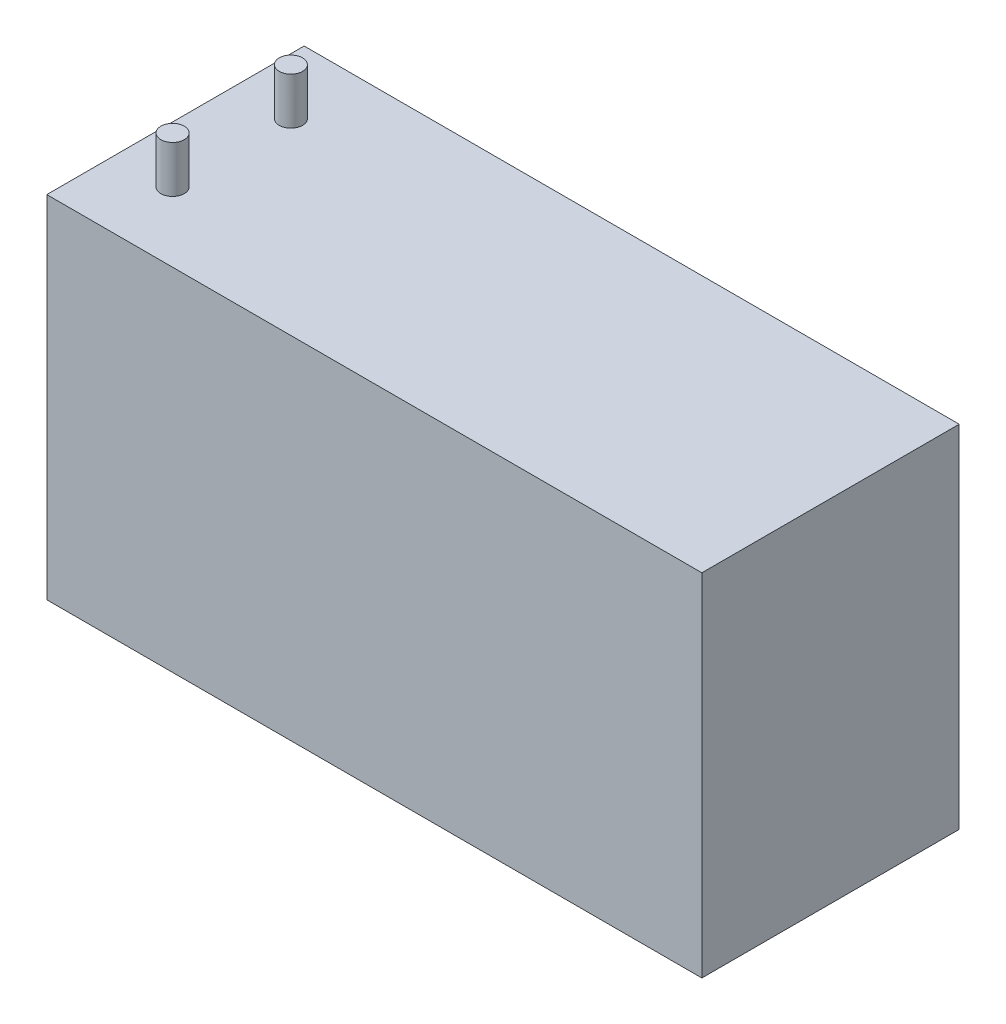
ISO-10303-21;
HEADER;
FILE_DESCRIPTION(('STEP AP214'),'2;1');
FILE_NAME('part.step','',(''),(''),'','','');
FILE_SCHEMA(('AUTOMOTIVE_DESIGN { 1 0 10303 214 1 1 1 1 }'));
ENDSEC;
DATA;
#1=APPLICATION_CONTEXT('core data for automotive mechanical design processes');
#2=APPLICATION_PROTOCOL_DEFINITION('international standard','automotive_design',2000,#1);
#3=PRODUCT_CONTEXT('',#1,'mechanical');
#4=PRODUCT('Part','Part','',(#3));
#5=PRODUCT_RELATED_PRODUCT_CATEGORY('part','',(#4));
#6=PRODUCT_DEFINITION_FORMATION('','',#4);
#7=PRODUCT_DEFINITION_CONTEXT('part definition',#1,'design');
#8=PRODUCT_DEFINITION('design','',#6,#7);
#9=PRODUCT_DEFINITION_SHAPE('','',#8);
#10=(LENGTH_UNIT() NAMED_UNIT(*) SI_UNIT(.MILLI.,.METRE.));
#11=(NAMED_UNIT(*) PLANE_ANGLE_UNIT() SI_UNIT($,.RADIAN.));
#12=(NAMED_UNIT(*) SI_UNIT($,.STERADIAN.) SOLID_ANGLE_UNIT());
#13=UNCERTAINTY_MEASURE_WITH_UNIT(LENGTH_MEASURE(1.E-05),#10,'distance_accuracy_value','');
#14=(GEOMETRIC_REPRESENTATION_CONTEXT(3) GLOBAL_UNCERTAINTY_ASSIGNED_CONTEXT((#13)) GLOBAL_UNIT_ASSIGNED_CONTEXT((#10,
#11,#12)) REPRESENTATION_CONTEXT('',''));
#15=CARTESIAN_POINT('',(0.,0.,0.));
#16=DIRECTION('',(0.,0.,1.));
#17=DIRECTION('',(1.,0.,0.));
#18=AXIS2_PLACEMENT_3D('',#15,#16,#17);
#19=CARTESIAN_POINT('',(14.,-7.5,11.));
#20=DIRECTION('',(-1.,0.,0.));
#21=DIRECTION('',(0.,0.,1.));
#22=AXIS2_PLACEMENT_3D('',#19,#20,#21);
#23=PLANE('',#22);
#24=DIRECTION('',(0.,1.,0.));
#25=VECTOR('',#24,1.);
#26=CARTESIAN_POINT('',(14.,-7.5,0.));
#27=LINE('',#26,#25);
#28=CARTESIAN_POINT('',(14.,-7.5,0.));
#29=VERTEX_POINT('',#28);
#30=CARTESIAN_POINT('',(14.,7.5,0.));
#31=VERTEX_POINT('',#30);
#32=EDGE_CURVE('E111',#29,#31,#27,.T.);
#33=ORIENTED_EDGE('',*,*,#32,.T.);
#34=DIRECTION('',(0.,0.,-1.));
#35=VECTOR('',#34,1.);
#36=CARTESIAN_POINT('',(14.,7.5,11.));
#37=LINE('',#36,#35);
#38=CARTESIAN_POINT('',(14.,7.5,11.));
#39=VERTEX_POINT('',#38);
#40=EDGE_CURVE('E100',#39,#31,#37,.T.);
#41=ORIENTED_EDGE('',*,*,#40,.F.);
#42=DIRECTION('',(0.,1.,0.));
#43=VECTOR('',#42,1.);
#44=CARTESIAN_POINT('',(14.,-7.5,11.));
#45=LINE('',#44,#43);
#46=CARTESIAN_POINT('',(14.,-7.5,11.));
#47=VERTEX_POINT('',#46);
#48=EDGE_CURVE('E92',#47,#39,#45,.T.);
#49=ORIENTED_EDGE('',*,*,#48,.F.);
#50=DIRECTION('',(0.,0.,-1.));
#51=VECTOR('',#50,1.);
#52=CARTESIAN_POINT('',(14.,-7.5,11.));
#53=LINE('',#52,#51);
#54=EDGE_CURVE('E107',#47,#29,#53,.T.);
#55=ORIENTED_EDGE('',*,*,#54,.T.);
#56=EDGE_LOOP('',(#33,#41,#49,#55));
#57=FACE_BOUND('',#56,.T.);
#58=ADVANCED_FACE('F39',(#57),#23,.F.);
#59=CARTESIAN_POINT('',(-14.,7.5,11.));
#60=DIRECTION('',(0.,-1.,0.));
#61=DIRECTION('',(0.,0.,-1.));
#62=AXIS2_PLACEMENT_3D('',#59,#60,#61);
#63=PLANE('',#62);
#64=CARTESIAN_POINT('',(-11.5946401527598,7.5,8.02818711278711));
#65=DIRECTION('',(0.,-1.,0.));
#66=DIRECTION('',(0.,0.,-1.));
#67=AXIS2_PLACEMENT_3D('',#64,#65,#66);
#68=CIRCLE('',#67,0.5);
#69=CARTESIAN_POINT('',(-11.5946401527598,7.5,7.52818711278711));
#70=VERTEX_POINT('',#69);
#71=EDGE_CURVE('E11',#70,#70,#68,.F.);
#72=ORIENTED_EDGE('',*,*,#71,.F.);
#73=EDGE_LOOP('',(#72));
#74=FACE_BOUND('',#73,.T.);
#75=CARTESIAN_POINT('',(-11.5946401527598,7.5,2.97181288721289));
#76=DIRECTION('',(0.,-1.,0.));
#77=DIRECTION('',(0.,0.,-1.));
#78=AXIS2_PLACEMENT_3D('',#75,#76,#77);
#79=CIRCLE('',#78,0.500000000000001);
#80=CARTESIAN_POINT('',(-11.5946401527598,7.5,2.47181288721289));
#81=VERTEX_POINT('',#80);
#82=EDGE_CURVE('E48',#81,#81,#79,.F.);
#83=ORIENTED_EDGE('',*,*,#82,.F.);
#84=EDGE_LOOP('',(#83));
#85=FACE_BOUND('',#84,.T.);
#86=DIRECTION('',(-1.,0.,0.));
#87=VECTOR('',#86,1.);
#88=CARTESIAN_POINT('',(-14.,7.5,0.));
#89=LINE('',#88,#87);
#90=CARTESIAN_POINT('',(-14.,7.5,0.));
#91=VERTEX_POINT('',#90);
#92=EDGE_CURVE('E98',#31,#91,#89,.T.);
#93=ORIENTED_EDGE('',*,*,#92,.T.);
#94=DIRECTION('',(0.,0.,-1.));
#95=VECTOR('',#94,1.);
#96=CARTESIAN_POINT('',(-14.,7.5,11.));
#97=LINE('',#96,#95);
#98=CARTESIAN_POINT('',(-14.,7.5,11.));
#99=VERTEX_POINT('',#98);
#100=EDGE_CURVE('E96',#99,#91,#97,.T.);
#101=ORIENTED_EDGE('',*,*,#100,.F.);
#102=DIRECTION('',(-1.,0.,0.));
#103=VECTOR('',#102,1.);
#104=CARTESIAN_POINT('',(-14.,7.5,11.));
#105=LINE('',#104,#103);
#106=EDGE_CURVE('E87',#39,#99,#105,.T.);
#107=ORIENTED_EDGE('',*,*,#106,.F.);
#108=ORIENTED_EDGE('',*,*,#40,.T.);
#109=EDGE_LOOP('',(#93,#101,#107,#108));
#110=FACE_BOUND('',#109,.T.);
#111=ADVANCED_FACE('F97',(#74,#85,#110),#63,.F.);
#112=CARTESIAN_POINT('',(-14.,-7.5,11.));
#113=DIRECTION('',(1.,0.,0.));
#114=DIRECTION('',(0.,0.,-1.));
#115=AXIS2_PLACEMENT_3D('',#112,#113,#114);
#116=PLANE('',#115);
#117=DIRECTION('',(0.,-1.,0.));
#118=VECTOR('',#117,1.);
#119=CARTESIAN_POINT('',(-14.,-7.5,0.));
#120=LINE('',#119,#118);
#121=CARTESIAN_POINT('',(-14.,-7.5,0.));
#122=VERTEX_POINT('',#121);
#123=EDGE_CURVE('E73',#91,#122,#120,.T.);
#124=ORIENTED_EDGE('',*,*,#123,.T.);
#125=DIRECTION('',(0.,0.,-1.));
#126=VECTOR('',#125,1.);
#127=CARTESIAN_POINT('',(-14.,-7.5,11.));
#128=LINE('',#127,#126);
#129=CARTESIAN_POINT('',(-14.,-7.5,11.));
#130=VERTEX_POINT('',#129);
#131=EDGE_CURVE('E101',#130,#122,#128,.T.);
#132=ORIENTED_EDGE('',*,*,#131,.F.);
#133=DIRECTION('',(0.,-1.,0.));
#134=VECTOR('',#133,1.);
#135=CARTESIAN_POINT('',(-14.,-7.5,11.));
#136=LINE('',#135,#134);
#137=EDGE_CURVE('E90',#99,#130,#136,.T.);
#138=ORIENTED_EDGE('',*,*,#137,.F.);
#139=ORIENTED_EDGE('',*,*,#100,.T.);
#140=EDGE_LOOP('',(#124,#132,#138,#139));
#141=FACE_BOUND('',#140,.T.);
#142=ADVANCED_FACE('F103',(#141),#116,.F.);
#143=CARTESIAN_POINT('',(-14.,-7.5,11.));
#144=DIRECTION('',(0.,1.,0.));
#145=DIRECTION('',(0.,0.,1.));
#146=AXIS2_PLACEMENT_3D('',#143,#144,#145);
#147=PLANE('',#146);
#148=DIRECTION('',(1.,0.,0.));
#149=VECTOR('',#148,1.);
#150=CARTESIAN_POINT('',(-14.,-7.5,0.));
#151=LINE('',#150,#149);
#152=EDGE_CURVE('E79',#122,#29,#151,.T.);
#153=ORIENTED_EDGE('',*,*,#152,.T.);
#154=ORIENTED_EDGE('',*,*,#54,.F.);
#155=DIRECTION('',(1.,0.,0.));
#156=VECTOR('',#155,1.);
#157=CARTESIAN_POINT('',(-14.,-7.5,11.));
#158=LINE('',#157,#156);
#159=EDGE_CURVE('E56',#130,#47,#158,.T.);
#160=ORIENTED_EDGE('',*,*,#159,.F.);
#161=ORIENTED_EDGE('',*,*,#131,.T.);
#162=EDGE_LOOP('',(#153,#154,#160,#161));
#163=FACE_BOUND('',#162,.T.);
#164=ADVANCED_FACE('F139',(#163),#147,.F.);
#165=CARTESIAN_POINT('',(0.,0.,11.));
#166=DIRECTION('',(0.,0.,-1.));
#167=DIRECTION('',(-1.,0.,0.));
#168=AXIS2_PLACEMENT_3D('',#165,#166,#167);
#169=PLANE('',#168);
#170=ORIENTED_EDGE('',*,*,#48,.T.);
#171=ORIENTED_EDGE('',*,*,#106,.T.);
#172=ORIENTED_EDGE('',*,*,#137,.T.);
#173=ORIENTED_EDGE('',*,*,#159,.T.);
#174=EDGE_LOOP('',(#170,#171,#172,#173));
#175=FACE_BOUND('',#174,.T.);
#176=ADVANCED_FACE('F88',(#175),#169,.F.);
#177=CARTESIAN_POINT('',(0.,0.,0.));
#178=DIRECTION('',(0.,0.,-1.));
#179=DIRECTION('',(-1.,0.,0.));
#180=AXIS2_PLACEMENT_3D('',#177,#178,#179);
#181=PLANE('',#180);
#182=ORIENTED_EDGE('',*,*,#32,.F.);
#183=ORIENTED_EDGE('',*,*,#152,.F.);
#184=ORIENTED_EDGE('',*,*,#123,.F.);
#185=ORIENTED_EDGE('',*,*,#92,.F.);
#186=EDGE_LOOP('',(#182,#183,#184,#185));
#187=FACE_BOUND('',#186,.T.);
#188=ADVANCED_FACE('F146',(#187),#181,.T.);
#189=CARTESIAN_POINT('',(-11.5946401527598,9.5,2.97181288721289));
#190=DIRECTION('',(0.,-1.,0.));
#191=DIRECTION('',(0.,0.,-1.));
#192=AXIS2_PLACEMENT_3D('',#189,#190,#191);
#193=CYLINDRICAL_SURFACE('',#192,0.500000000000001);
#194=CARTESIAN_POINT('',(-11.5946401527598,9.5,2.97181288721289));
#195=DIRECTION('',(0.,1.,0.));
#196=DIRECTION('',(0.,0.,1.));
#197=AXIS2_PLACEMENT_3D('',#194,#195,#196);
#198=CIRCLE('',#197,0.500000000000001);
#199=CARTESIAN_POINT('',(-11.5946401527598,9.5,3.47181288721289));
#200=VERTEX_POINT('',#199);
#201=EDGE_CURVE('E115',#200,#200,#198,.T.);
#202=ORIENTED_EDGE('',*,*,#201,.F.);
#203=EDGE_LOOP('',(#202));
#204=FACE_BOUND('',#203,.T.);
#205=ORIENTED_EDGE('',*,*,#82,.T.);
#206=EDGE_LOOP('',(#205));
#207=FACE_BOUND('',#206,.T.);
#208=ADVANCED_FACE('F131',(#204,#207),#193,.T.);
#209=CARTESIAN_POINT('',(-11.5946401527598,9.5,2.97181288721289));
#210=DIRECTION('',(0.,1.,0.));
#211=DIRECTION('',(0.,0.,1.));
#212=AXIS2_PLACEMENT_3D('',#209,#210,#211);
#213=PLANE('',#212);
#214=ORIENTED_EDGE('',*,*,#201,.T.);
#215=EDGE_LOOP('',(#214));
#216=FACE_BOUND('',#215,.T.);
#217=ADVANCED_FACE('F154',(#216),#213,.T.);
#218=CARTESIAN_POINT('',(-11.5946401527598,9.5,8.02818711278711));
#219=DIRECTION('',(0.,-1.,0.));
#220=DIRECTION('',(0.,0.,-1.));
#221=AXIS2_PLACEMENT_3D('',#218,#219,#220);
#222=CYLINDRICAL_SURFACE('',#221,0.5);
#223=CARTESIAN_POINT('',(-11.5946401527598,9.5,8.02818711278711));
#224=DIRECTION('',(0.,1.,0.));
#225=DIRECTION('',(0.,0.,-1.));
#226=AXIS2_PLACEMENT_3D('',#223,#224,#225);
#227=CIRCLE('',#226,0.5);
#228=CARTESIAN_POINT('',(-11.5946401527598,9.5,7.52818711278711));
#229=VERTEX_POINT('',#228);
#230=EDGE_CURVE('E170',#229,#229,#227,.T.);
#231=ORIENTED_EDGE('',*,*,#230,.F.);
#232=EDGE_LOOP('',(#231));
#233=FACE_BOUND('',#232,.T.);
#234=ORIENTED_EDGE('',*,*,#71,.T.);
#235=EDGE_LOOP('',(#234));
#236=FACE_BOUND('',#235,.T.);
#237=ADVANCED_FACE('F158',(#233,#236),#222,.T.);
#238=CARTESIAN_POINT('',(-11.5946401527598,9.5,8.02818711278711));
#239=DIRECTION('',(0.,-1.,0.));
#240=DIRECTION('',(0.,0.,-1.));
#241=AXIS2_PLACEMENT_3D('',#238,#239,#240);
#242=PLANE('',#241);
#243=ORIENTED_EDGE('',*,*,#230,.T.);
#244=EDGE_LOOP('',(#243));
#245=FACE_BOUND('',#244,.T.);
#246=ADVANCED_FACE('F162',(#245),#242,.F.);
#247=CLOSED_SHELL('',(#58,#111,#142,#164,#176,#188,#208,#217,#237,#246));
#248=MANIFOLD_SOLID_BREP('B2',#247);
#249=ADVANCED_BREP_SHAPE_REPRESENTATION('',(#18,#248),#14);
#250=SHAPE_DEFINITION_REPRESENTATION(#9,#249);
ENDSEC;
END-ISO-10303-21;
